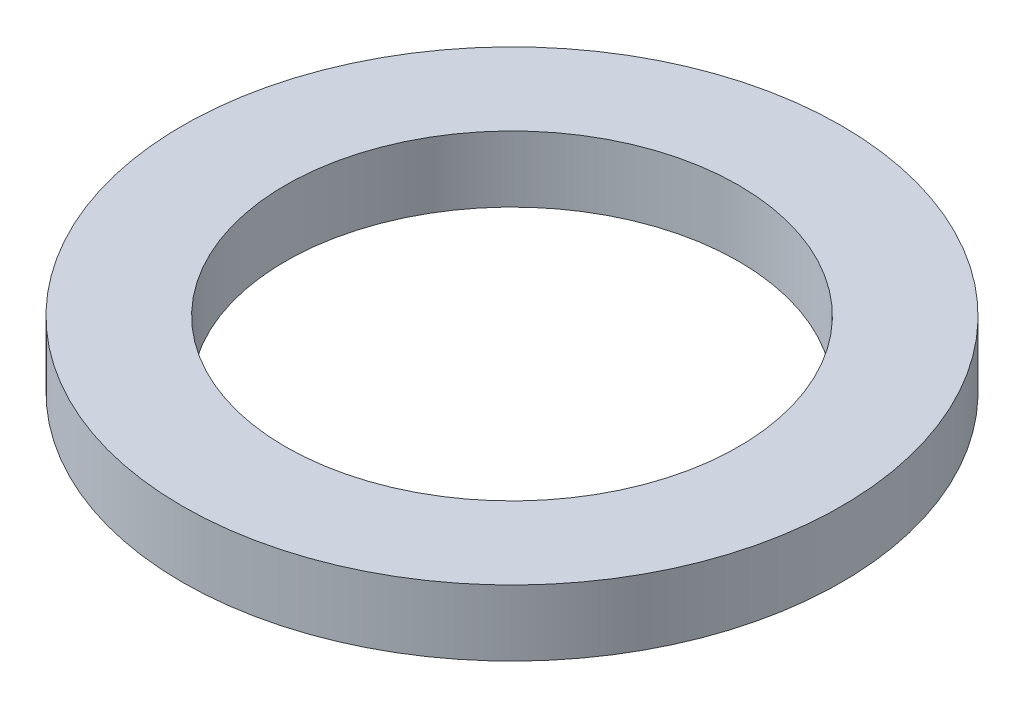
ISO-10303-21;
HEADER;
FILE_DESCRIPTION(('STEP AP214'),'2;1');
FILE_NAME('part.step','',(''),(''),'','','');
FILE_SCHEMA(('AUTOMOTIVE_DESIGN { 1 0 10303 214 1 1 1 1 }'));
ENDSEC;
DATA;
#1=APPLICATION_CONTEXT('core data for automotive mechanical design processes');
#2=APPLICATION_PROTOCOL_DEFINITION('international standard','automotive_design',2000,#1);
#3=PRODUCT_CONTEXT('',#1,'mechanical');
#4=PRODUCT('Part','Part','',(#3));
#5=PRODUCT_RELATED_PRODUCT_CATEGORY('part','',(#4));
#6=PRODUCT_DEFINITION_FORMATION('','',#4);
#7=PRODUCT_DEFINITION_CONTEXT('part definition',#1,'design');
#8=PRODUCT_DEFINITION('design','',#6,#7);
#9=PRODUCT_DEFINITION_SHAPE('','',#8);
#10=(LENGTH_UNIT() NAMED_UNIT(*) SI_UNIT(.MILLI.,.METRE.));
#11=(NAMED_UNIT(*) PLANE_ANGLE_UNIT() SI_UNIT($,.RADIAN.));
#12=(NAMED_UNIT(*) SI_UNIT($,.STERADIAN.) SOLID_ANGLE_UNIT());
#13=UNCERTAINTY_MEASURE_WITH_UNIT(LENGTH_MEASURE(1.E-05),#10,'distance_accuracy_value','');
#14=(GEOMETRIC_REPRESENTATION_CONTEXT(3) GLOBAL_UNCERTAINTY_ASSIGNED_CONTEXT((#13)) GLOBAL_UNIT_ASSIGNED_CONTEXT((#10,
#11,#12)) REPRESENTATION_CONTEXT('',''));
#15=CARTESIAN_POINT('',(0.,0.,0.));
#16=DIRECTION('',(0.,0.,1.));
#17=DIRECTION('',(1.,0.,0.));
#18=AXIS2_PLACEMENT_3D('',#15,#16,#17);
#19=CARTESIAN_POINT('',(0.,1.6,0.));
#20=DIRECTION('',(0.,1.,0.));
#21=DIRECTION('',(0.,0.,1.));
#22=AXIS2_PLACEMENT_3D('',#19,#20,#21);
#23=PLANE('',#22);
#24=CARTESIAN_POINT('',(0.,1.6,0.));
#25=DIRECTION('',(0.,1.,0.));
#26=DIRECTION('',(0.,0.,1.));
#27=AXIS2_PLACEMENT_3D('',#24,#25,#26);
#28=CIRCLE('',#27,16.);
#29=CARTESIAN_POINT('',(0.,1.6,16.));
#30=VERTEX_POINT('',#29);
#31=EDGE_CURVE('E10',#30,#30,#28,.T.);
#32=ORIENTED_EDGE('',*,*,#31,.T.);
#33=EDGE_LOOP('',(#32));
#34=FACE_BOUND('',#33,.T.);
#35=CARTESIAN_POINT('',(0.,1.6,0.));
#36=DIRECTION('',(0.,1.,0.));
#37=DIRECTION('',(0.,0.,1.));
#38=AXIS2_PLACEMENT_3D('',#35,#36,#37);
#39=CIRCLE('',#38,11.);
#40=CARTESIAN_POINT('',(0.,1.6,11.));
#41=VERTEX_POINT('',#40);
#42=EDGE_CURVE('E48',#41,#41,#39,.T.);
#43=ORIENTED_EDGE('',*,*,#42,.F.);
#44=EDGE_LOOP('',(#43));
#45=FACE_BOUND('',#44,.T.);
#46=ADVANCED_FACE('F37',(#34,#45),#23,.T.);
#47=CARTESIAN_POINT('',(0.,-1.6,0.));
#48=DIRECTION('',(0.,1.,0.));
#49=DIRECTION('',(0.,0.,1.));
#50=AXIS2_PLACEMENT_3D('',#47,#48,#49);
#51=PLANE('',#50);
#52=CARTESIAN_POINT('',(0.,-1.6,0.));
#53=DIRECTION('',(0.,1.,0.));
#54=DIRECTION('',(0.,0.,1.));
#55=AXIS2_PLACEMENT_3D('',#52,#53,#54);
#56=CIRCLE('',#55,16.);
#57=CARTESIAN_POINT('',(0.,-1.6,16.));
#58=VERTEX_POINT('',#57);
#59=EDGE_CURVE('E41',#58,#58,#56,.T.);
#60=ORIENTED_EDGE('',*,*,#59,.F.);
#61=EDGE_LOOP('',(#60));
#62=FACE_BOUND('',#61,.T.);
#63=CARTESIAN_POINT('',(0.,-1.6,0.));
#64=DIRECTION('',(0.,1.,0.));
#65=DIRECTION('',(0.,0.,1.));
#66=AXIS2_PLACEMENT_3D('',#63,#64,#65);
#67=CIRCLE('',#66,11.);
#68=CARTESIAN_POINT('',(0.,-1.6,11.));
#69=VERTEX_POINT('',#68);
#70=EDGE_CURVE('E50',#69,#69,#67,.T.);
#71=ORIENTED_EDGE('',*,*,#70,.T.);
#72=EDGE_LOOP('',(#71));
#73=FACE_BOUND('',#72,.T.);
#74=ADVANCED_FACE('F60',(#62,#73),#51,.F.);
#75=CARTESIAN_POINT('',(0.,1.6,0.));
#76=DIRECTION('',(0.,-1.,0.));
#77=DIRECTION('',(0.,0.,-1.));
#78=AXIS2_PLACEMENT_3D('',#75,#76,#77);
#79=CYLINDRICAL_SURFACE('',#78,16.);
#80=ORIENTED_EDGE('',*,*,#31,.F.);
#81=EDGE_LOOP('',(#80));
#82=FACE_BOUND('',#81,.T.);
#83=ORIENTED_EDGE('',*,*,#59,.T.);
#84=EDGE_LOOP('',(#83));
#85=FACE_BOUND('',#84,.T.);
#86=ADVANCED_FACE('F39',(#82,#85),#79,.T.);
#87=CARTESIAN_POINT('',(0.,1.6,0.));
#88=DIRECTION('',(0.,-1.,0.));
#89=DIRECTION('',(0.,0.,-1.));
#90=AXIS2_PLACEMENT_3D('',#87,#88,#89);
#91=CYLINDRICAL_SURFACE('',#90,11.);
#92=ORIENTED_EDGE('',*,*,#42,.T.);
#93=EDGE_LOOP('',(#92));
#94=FACE_BOUND('',#93,.T.);
#95=ORIENTED_EDGE('',*,*,#70,.F.);
#96=EDGE_LOOP('',(#95));
#97=FACE_BOUND('',#96,.T.);
#98=ADVANCED_FACE('F56',(#94,#97),#91,.F.);
#99=CLOSED_SHELL('',(#46,#74,#86,#98));
#100=MANIFOLD_SOLID_BREP('B2',#99);
#101=ADVANCED_BREP_SHAPE_REPRESENTATION('',(#18,#100),#14);
#102=SHAPE_DEFINITION_REPRESENTATION(#9,#101);
ENDSEC;
END-ISO-10303-21;
